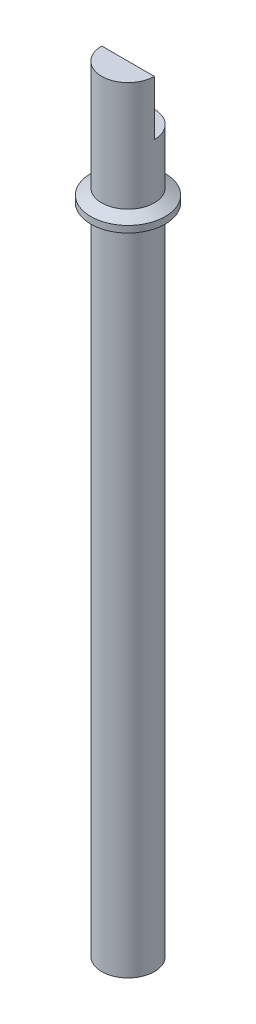
ISO-10303-21;
HEADER;
FILE_DESCRIPTION(('STEP AP214'),'2;1');
FILE_NAME('part.step','',(''),(''),'','','');
FILE_SCHEMA(('AUTOMOTIVE_DESIGN { 1 0 10303 214 1 1 1 1 }'));
ENDSEC;
DATA;
#1=APPLICATION_CONTEXT('core data for automotive mechanical design processes');
#2=APPLICATION_PROTOCOL_DEFINITION('international standard','automotive_design',2000,#1);
#3=PRODUCT_CONTEXT('',#1,'mechanical');
#4=PRODUCT('Part','Part','',(#3));
#5=PRODUCT_RELATED_PRODUCT_CATEGORY('part','',(#4));
#6=PRODUCT_DEFINITION_FORMATION('','',#4);
#7=PRODUCT_DEFINITION_CONTEXT('part definition',#1,'design');
#8=PRODUCT_DEFINITION('design','',#6,#7);
#9=PRODUCT_DEFINITION_SHAPE('','',#8);
#10=(LENGTH_UNIT() NAMED_UNIT(*) SI_UNIT(.MILLI.,.METRE.));
#11=(NAMED_UNIT(*) PLANE_ANGLE_UNIT() SI_UNIT($,.RADIAN.));
#12=(NAMED_UNIT(*) SI_UNIT($,.STERADIAN.) SOLID_ANGLE_UNIT());
#13=UNCERTAINTY_MEASURE_WITH_UNIT(LENGTH_MEASURE(1.E-05),#10,'distance_accuracy_value','');
#14=(GEOMETRIC_REPRESENTATION_CONTEXT(3) GLOBAL_UNCERTAINTY_ASSIGNED_CONTEXT((#13)) GLOBAL_UNIT_ASSIGNED_CONTEXT((#10,
#11,#12)) REPRESENTATION_CONTEXT('',''));
#15=CARTESIAN_POINT('',(0.,0.,0.));
#16=DIRECTION('',(0.,0.,1.));
#17=DIRECTION('',(1.,0.,0.));
#18=AXIS2_PLACEMENT_3D('',#15,#16,#17);
#19=CARTESIAN_POINT('',(0.6,0.,0.));
#20=DIRECTION('',(0.,-1.,0.));
#21=DIRECTION('',(0.,0.,-1.));
#22=AXIS2_PLACEMENT_3D('',#19,#20,#21);
#23=PLANE('',#22);
#24=CARTESIAN_POINT('',(0.6,0.,0.));
#25=DIRECTION('',(0.,-1.,0.));
#26=DIRECTION('',(0.,0.,-1.));
#27=AXIS2_PLACEMENT_3D('',#24,#25,#26);
#28=CIRCLE('',#27,0.6);
#29=CARTESIAN_POINT('',(1.2,0.,0.));
#30=VERTEX_POINT('',#29);
#31=CARTESIAN_POINT('',(0.,0.,0.));
#32=VERTEX_POINT('',#31);
#33=EDGE_CURVE('E11',#30,#32,#28,.T.);
#34=ORIENTED_EDGE('',*,*,#33,.F.);
#35=DIRECTION('',(1.,0.,0.));
#36=VECTOR('',#35,1.);
#37=CARTESIAN_POINT('',(0.,0.,0.));
#38=LINE('',#37,#36);
#39=EDGE_CURVE('E60',#32,#30,#38,.T.);
#40=ORIENTED_EDGE('',*,*,#39,.F.);
#41=EDGE_LOOP('',(#34,#40));
#42=FACE_BOUND('',#41,.T.);
#43=ADVANCED_FACE('F32',(#42),#23,.F.);
#44=CARTESIAN_POINT('',(0.6,-17.6886751345948,0.));
#45=DIRECTION('',(0.,-1.,0.));
#46=DIRECTION('',(0.,0.,-1.));
#47=AXIS2_PLACEMENT_3D('',#44,#45,#46);
#48=CYLINDRICAL_SURFACE('',#47,0.6);
#49=ORIENTED_EDGE('',*,*,#33,.T.);
#50=DIRECTION('',(0.,1.,0.));
#51=VECTOR('',#50,1.);
#52=CARTESIAN_POINT('',(0.,-1.25,0.));
#53=LINE('',#52,#51);
#54=CARTESIAN_POINT('',(0.,-1.25,0.));
#55=VERTEX_POINT('',#54);
#56=EDGE_CURVE('E57',#55,#32,#53,.T.);
#57=ORIENTED_EDGE('',*,*,#56,.F.);
#58=CARTESIAN_POINT('',(0.6,-1.25,0.));
#59=DIRECTION('',(0.,1.,0.));
#60=DIRECTION('',(0.,0.,1.));
#61=AXIS2_PLACEMENT_3D('',#58,#59,#60);
#62=CIRCLE('',#61,0.6);
#63=CARTESIAN_POINT('',(1.2,-1.25,0.));
#64=VERTEX_POINT('',#63);
#65=EDGE_CURVE('E50',#64,#55,#62,.T.);
#66=ORIENTED_EDGE('',*,*,#65,.F.);
#67=DIRECTION('',(0.,1.,0.));
#68=VECTOR('',#67,1.);
#69=CARTESIAN_POINT('',(1.2,-1.25,0.));
#70=LINE('',#69,#68);
#71=EDGE_CURVE('E63',#64,#30,#70,.T.);
#72=ORIENTED_EDGE('',*,*,#71,.T.);
#73=EDGE_LOOP('',(#49,#57,#66,#72));
#74=FACE_BOUND('',#73,.T.);
#75=CARTESIAN_POINT('',(0.6,-2.5,0.));
#76=DIRECTION('',(0.,-1.,0.));
#77=DIRECTION('',(0.,0.,-1.));
#78=AXIS2_PLACEMENT_3D('',#75,#76,#77);
#79=CIRCLE('',#78,0.6);
#80=CARTESIAN_POINT('',(0.6,-2.5,-0.6));
#81=VERTEX_POINT('',#80);
#82=EDGE_CURVE('E39',#81,#81,#79,.T.);
#83=ORIENTED_EDGE('',*,*,#82,.F.);
#84=EDGE_LOOP('',(#83));
#85=FACE_BOUND('',#84,.T.);
#86=ADVANCED_FACE('F68',(#74,#85),#48,.T.);
#87=CARTESIAN_POINT('',(0.6,-2.5,0.));
#88=DIRECTION('',(0.,-1.,0.));
#89=DIRECTION('',(0.,0.,-1.));
#90=AXIS2_PLACEMENT_3D('',#87,#88,#89);
#91=CONICAL_SURFACE('',#90,0.6,1.0471975511966);
#92=CARTESIAN_POINT('',(0.6,-2.64433756729741,0.));
#93=DIRECTION('',(0.,-1.,0.));
#94=DIRECTION('',(0.,0.,-1.));
#95=AXIS2_PLACEMENT_3D('',#92,#93,#94);
#96=CIRCLE('',#95,0.85);
#97=CARTESIAN_POINT('',(0.6,-2.64433756729741,-0.85));
#98=VERTEX_POINT('',#97);
#99=EDGE_CURVE('E82',#98,#98,#96,.T.);
#100=ORIENTED_EDGE('',*,*,#99,.F.);
#101=EDGE_LOOP('',(#100));
#102=FACE_BOUND('',#101,.T.);
#103=ORIENTED_EDGE('',*,*,#82,.T.);
#104=EDGE_LOOP('',(#103));
#105=FACE_BOUND('',#104,.T.);
#106=ADVANCED_FACE('F87',(#102,#105),#91,.T.);
#107=CARTESIAN_POINT('',(0.6,-17.6886751345948,0.));
#108=DIRECTION('',(0.,-1.,0.));
#109=DIRECTION('',(0.,0.,-1.));
#110=AXIS2_PLACEMENT_3D('',#107,#108,#109);
#111=CYLINDRICAL_SURFACE('',#110,0.85);
#112=CARTESIAN_POINT('',(0.6,-2.79433756729741,0.));
#113=DIRECTION('',(0.,-1.,0.));
#114=DIRECTION('',(0.,0.,-1.));
#115=AXIS2_PLACEMENT_3D('',#112,#113,#114);
#116=CIRCLE('',#115,0.85);
#117=CARTESIAN_POINT('',(0.6,-2.79433756729741,-0.85));
#118=VERTEX_POINT('',#117);
#119=EDGE_CURVE('E79',#118,#118,#116,.T.);
#120=ORIENTED_EDGE('',*,*,#119,.F.);
#121=EDGE_LOOP('',(#120));
#122=FACE_BOUND('',#121,.T.);
#123=ORIENTED_EDGE('',*,*,#99,.T.);
#124=EDGE_LOOP('',(#123));
#125=FACE_BOUND('',#124,.T.);
#126=ADVANCED_FACE('F93',(#122,#125),#111,.T.);
#127=CARTESIAN_POINT('',(0.6,-2.79433756729741,0.));
#128=DIRECTION('',(0.,1.,0.));
#129=DIRECTION('',(0.,0.,1.));
#130=AXIS2_PLACEMENT_3D('',#127,#128,#129);
#131=CONICAL_SURFACE('',#130,0.85,1.0471975511966);
#132=CARTESIAN_POINT('',(0.6,-2.93867513459481,0.));
#133=DIRECTION('',(0.,-1.,0.));
#134=DIRECTION('',(0.,0.,-1.));
#135=AXIS2_PLACEMENT_3D('',#132,#133,#134);
#136=CIRCLE('',#135,0.6);
#137=CARTESIAN_POINT('',(0.6,-2.93867513459481,-0.6));
#138=VERTEX_POINT('',#137);
#139=EDGE_CURVE('E73',#138,#138,#136,.T.);
#140=ORIENTED_EDGE('',*,*,#139,.F.);
#141=EDGE_LOOP('',(#140));
#142=FACE_BOUND('',#141,.T.);
#143=ORIENTED_EDGE('',*,*,#119,.T.);
#144=EDGE_LOOP('',(#143));
#145=FACE_BOUND('',#144,.T.);
#146=ADVANCED_FACE('F99',(#142,#145),#131,.T.);
#147=CARTESIAN_POINT('',(0.6,-17.6886751345948,0.));
#148=DIRECTION('',(0.,-1.,0.));
#149=DIRECTION('',(0.,0.,-1.));
#150=AXIS2_PLACEMENT_3D('',#147,#148,#149);
#151=CYLINDRICAL_SURFACE('',#150,0.599999999999999);
#152=CARTESIAN_POINT('',(0.6,-17.6886751345948,0.));
#153=DIRECTION('',(0.,-1.,0.));
#154=DIRECTION('',(0.,0.,-1.));
#155=AXIS2_PLACEMENT_3D('',#152,#153,#154);
#156=CIRCLE('',#155,0.599999999999998);
#157=CARTESIAN_POINT('',(0.6,-17.6886751345948,-0.599999999999998));
#158=VERTEX_POINT('',#157);
#159=EDGE_CURVE('E70',#158,#158,#156,.T.);
#160=ORIENTED_EDGE('',*,*,#159,.F.);
#161=EDGE_LOOP('',(#160));
#162=FACE_BOUND('',#161,.T.);
#163=ORIENTED_EDGE('',*,*,#139,.T.);
#164=EDGE_LOOP('',(#163));
#165=FACE_BOUND('',#164,.T.);
#166=ADVANCED_FACE('F103',(#162,#165),#151,.T.);
#167=CARTESIAN_POINT('',(0.,-17.6886751345948,0.));
#168=DIRECTION('',(0.,1.,0.));
#169=DIRECTION('',(0.,0.,1.));
#170=AXIS2_PLACEMENT_3D('',#167,#168,#169);
#171=PLANE('',#170);
#172=ORIENTED_EDGE('',*,*,#159,.T.);
#173=EDGE_LOOP('',(#172));
#174=FACE_BOUND('',#173,.T.);
#175=ADVANCED_FACE('F107',(#174),#171,.F.);
#176=CARTESIAN_POINT('',(0.,-1.25,0.));
#177=DIRECTION('',(0.,0.,1.));
#178=DIRECTION('',(1.,0.,0.));
#179=AXIS2_PLACEMENT_3D('',#176,#177,#178);
#180=PLANE('',#179);
#181=ORIENTED_EDGE('',*,*,#39,.T.);
#182=ORIENTED_EDGE('',*,*,#71,.F.);
#183=DIRECTION('',(1.,0.,0.));
#184=VECTOR('',#183,1.);
#185=CARTESIAN_POINT('',(0.,-1.25,0.));
#186=LINE('',#185,#184);
#187=EDGE_CURVE('E45',#55,#64,#186,.T.);
#188=ORIENTED_EDGE('',*,*,#187,.F.);
#189=ORIENTED_EDGE('',*,*,#56,.T.);
#190=EDGE_LOOP('',(#181,#182,#188,#189));
#191=FACE_BOUND('',#190,.T.);
#192=ADVANCED_FACE('F59',(#191),#180,.F.);
#193=CARTESIAN_POINT('',(0.6,-1.25,0.));
#194=DIRECTION('',(0.,1.,0.));
#195=DIRECTION('',(0.,0.,1.));
#196=AXIS2_PLACEMENT_3D('',#193,#194,#195);
#197=PLANE('',#196);
#198=ORIENTED_EDGE('',*,*,#65,.T.);
#199=ORIENTED_EDGE('',*,*,#187,.T.);
#200=EDGE_LOOP('',(#198,#199));
#201=FACE_BOUND('',#200,.T.);
#202=ADVANCED_FACE('F114',(#201),#197,.T.);
#203=CLOSED_SHELL('',(#43,#86,#106,#126,#146,#166,#175,#192,#202));
#204=MANIFOLD_SOLID_BREP('B2',#203);
#205=ADVANCED_BREP_SHAPE_REPRESENTATION('',(#18,#204),#14);
#206=SHAPE_DEFINITION_REPRESENTATION(#9,#205);
ENDSEC;
END-ISO-10303-21;
